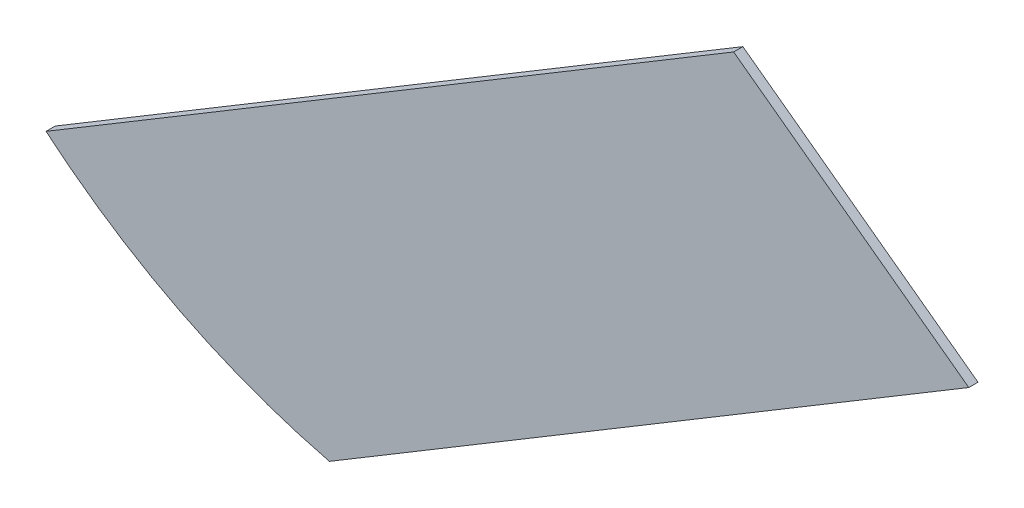
ISO-10303-21;
HEADER;
FILE_DESCRIPTION(('STEP AP214'),'2;1');
FILE_NAME('part.step','',(''),(''),'','','');
FILE_SCHEMA(('AUTOMOTIVE_DESIGN { 1 0 10303 214 1 1 1 1 }'));
ENDSEC;
DATA;
#1=APPLICATION_CONTEXT('core data for automotive mechanical design processes');
#2=APPLICATION_PROTOCOL_DEFINITION('international standard','automotive_design',2000,#1);
#3=PRODUCT_CONTEXT('',#1,'mechanical');
#4=PRODUCT('Part','Part','',(#3));
#5=PRODUCT_RELATED_PRODUCT_CATEGORY('part','',(#4));
#6=PRODUCT_DEFINITION_FORMATION('','',#4);
#7=PRODUCT_DEFINITION_CONTEXT('part definition',#1,'design');
#8=PRODUCT_DEFINITION('design','',#6,#7);
#9=PRODUCT_DEFINITION_SHAPE('','',#8);
#10=(LENGTH_UNIT() NAMED_UNIT(*) SI_UNIT(.MILLI.,.METRE.));
#11=(NAMED_UNIT(*) PLANE_ANGLE_UNIT() SI_UNIT($,.RADIAN.));
#12=(NAMED_UNIT(*) SI_UNIT($,.STERADIAN.) SOLID_ANGLE_UNIT());
#13=UNCERTAINTY_MEASURE_WITH_UNIT(LENGTH_MEASURE(1.E-05),#10,'distance_accuracy_value','');
#14=(GEOMETRIC_REPRESENTATION_CONTEXT(3) GLOBAL_UNCERTAINTY_ASSIGNED_CONTEXT((#13)) GLOBAL_UNIT_ASSIGNED_CONTEXT((#10,
#11,#12)) REPRESENTATION_CONTEXT('',''));
#15=CARTESIAN_POINT('',(0.,0.,0.));
#16=DIRECTION('',(0.,0.,1.));
#17=DIRECTION('',(1.,0.,0.));
#18=AXIS2_PLACEMENT_3D('',#15,#16,#17);
#19=CARTESIAN_POINT('',(32.574920494297,13.734089114766,2.65));
#20=DIRECTION('',(0.,0.,1.));
#21=DIRECTION('',(1.,0.,0.));
#22=AXIS2_PLACEMENT_3D('',#19,#20,#21);
#23=PLANE('',#22);
#24=CARTESIAN_POINT('',(31.455723480902,16.979222091636,2.65));
#25=DIRECTION('',(0.,0.,-1.));
#26=DIRECTION('',(-1.,0.,0.));
#27=AXIS2_PLACEMENT_3D('',#24,#25,#26);
#28=CIRCLE('',#27,0.7589976);
#29=CARTESIAN_POINT('',(31.2743120899408,16.2422232476328,2.65));
#30=VERTEX_POINT('',#29);
#31=CARTESIAN_POINT('',(30.9670153201947,16.398496949711,2.65));
#32=VERTEX_POINT('',#31);
#33=EDGE_CURVE('E20',#30,#32,#28,.T.);
#34=ORIENTED_EDGE('',*,*,#33,.F.);
#35=DIRECTION('',(-0.857492968552453,-0.514495684027672,0.));
#36=VECTOR('',#35,1.);
#37=CARTESIAN_POINT('',(31.620977437551,16.450222416942,2.65));
#38=LINE('',#37,#36);
#39=CARTESIAN_POINT('',(31.9676428108402,16.6582216016585,2.65));
#40=VERTEX_POINT('',#39);
#41=EDGE_CURVE('E75',#30,#40,#38,.F.);
#42=ORIENTED_EDGE('',*,*,#41,.T.);
#43=DIRECTION('',(0.805324891887206,-0.592833719104152,0.));
#44=VECTOR('',#43,1.);
#45=CARTESIAN_POINT('',(31.840166961259,16.752061966913,2.65));
#46=LINE('',#45,#44);
#47=CARTESIAN_POINT('',(31.712691111678,16.8459023321673,2.65));
#48=VERTEX_POINT('',#47);
#49=EDGE_CURVE('E66',#40,#48,#46,.F.);
#50=ORIENTED_EDGE('',*,*,#49,.T.);
#51=DIRECTION('',(-0.857492968552453,-0.514495684027672,0.));
#52=VECTOR('',#51,1.);
#53=CARTESIAN_POINT('',(31.339853199579,16.622199627129,2.65));
#54=LINE('',#53,#52);
#55=EDGE_CURVE('E64',#32,#48,#54,.F.);
#56=ORIENTED_EDGE('',*,*,#55,.F.);
#57=EDGE_LOOP('',(#34,#42,#50,#56));
#58=FACE_BOUND('',#57,.T.);
#59=ADVANCED_FACE('F17',(#58),#23,.T.);
#60=CARTESIAN_POINT('',(31.339853199579,16.622199627129,2.64));
#61=DIRECTION('',(-0.514495684027672,0.857492968552453,0.));
#62=DIRECTION('',(-0.857492968552453,-0.514495684027672,0.));
#63=AXIS2_PLACEMENT_3D('',#60,#61,#62);
#64=PLANE('',#63);
#65=DIRECTION('',(-0.857492968552828,-0.514495684027046,0.));
#66=VECTOR('',#65,1.);
#67=CARTESIAN_POINT('',(31.712691111678,16.845902332167,2.64));
#68=LINE('',#67,#66);
#69=CARTESIAN_POINT('',(31.7126911116781,16.8459023321671,2.64));
#70=VERTEX_POINT('',#69);
#71=CARTESIAN_POINT('',(30.9670153201947,16.398496949711,2.64));
#72=VERTEX_POINT('',#71);
#73=EDGE_CURVE('E73',#70,#72,#68,.T.);
#74=ORIENTED_EDGE('',*,*,#73,.T.);
#75=DIRECTION('',(0.,0.,-1.));
#76=VECTOR('',#75,1.);
#77=CARTESIAN_POINT('',(30.9670153146508,16.3984969543765,2.64));
#78=LINE('',#77,#76);
#79=EDGE_CURVE('E61',#32,#72,#78,.T.);
#80=ORIENTED_EDGE('',*,*,#79,.F.);
#81=ORIENTED_EDGE('',*,*,#55,.T.);
#82=DIRECTION('',(0.,0.,1.));
#83=VECTOR('',#82,1.);
#84=CARTESIAN_POINT('',(31.7126911116781,16.8459023321672,2.64));
#85=LINE('',#84,#83);
#86=EDGE_CURVE('E81',#48,#70,#85,.F.);
#87=ORIENTED_EDGE('',*,*,#86,.T.);
#88=EDGE_LOOP('',(#74,#80,#81,#87));
#89=FACE_BOUND('',#88,.T.);
#90=ADVANCED_FACE('F72',(#89),#64,.T.);
#91=CARTESIAN_POINT('',(31.455723480902,16.979222091636,2.64));
#92=DIRECTION('',(0.,0.,-1.));
#93=DIRECTION('',(-1.,0.,0.));
#94=AXIS2_PLACEMENT_3D('',#91,#92,#93);
#95=CYLINDRICAL_SURFACE('',#94,0.7589976);
#96=CARTESIAN_POINT('',(31.455723480902,16.979222091636,2.64));
#97=DIRECTION('',(0.,0.,-1.));
#98=DIRECTION('',(-1.,0.,0.));
#99=AXIS2_PLACEMENT_3D('',#96,#97,#98);
#100=CIRCLE('',#99,0.7589976);
#101=CARTESIAN_POINT('',(31.2743120899405,16.2422232476328,2.64));
#102=VERTEX_POINT('',#101);
#103=EDGE_CURVE('E92',#72,#102,#100,.F.);
#104=ORIENTED_EDGE('',*,*,#103,.T.);
#105=DIRECTION('',(0.,0.,1.));
#106=VECTOR('',#105,1.);
#107=CARTESIAN_POINT('',(31.2743120642622,16.2422232322256,2.64));
#108=LINE('',#107,#106);
#109=EDGE_CURVE('E63',#102,#30,#108,.T.);
#110=ORIENTED_EDGE('',*,*,#109,.T.);
#111=ORIENTED_EDGE('',*,*,#33,.T.);
#112=ORIENTED_EDGE('',*,*,#79,.T.);
#113=EDGE_LOOP('',(#104,#110,#111,#112));
#114=FACE_BOUND('',#113,.T.);
#115=ADVANCED_FACE('F59',(#114),#95,.T.);
#116=CARTESIAN_POINT('',(31.620977437551,16.450222416942,2.64));
#117=DIRECTION('',(-0.514495684027672,0.857492968552453,0.));
#118=DIRECTION('',(-0.857492968552453,-0.514495684027672,0.));
#119=AXIS2_PLACEMENT_3D('',#116,#117,#118);
#120=PLANE('',#119);
#121=ORIENTED_EDGE('',*,*,#109,.F.);
#122=DIRECTION('',(0.857492968552989,0.514495684026778,0.));
#123=VECTOR('',#122,1.);
#124=CARTESIAN_POINT('',(31.274312064262,16.242223232226,2.64));
#125=LINE('',#124,#123);
#126=CARTESIAN_POINT('',(31.9676428108401,16.6582216016582,2.64));
#127=VERTEX_POINT('',#126);
#128=EDGE_CURVE('E26',#102,#127,#125,.T.);
#129=ORIENTED_EDGE('',*,*,#128,.T.);
#130=DIRECTION('',(0.,0.,1.));
#131=VECTOR('',#130,1.);
#132=CARTESIAN_POINT('',(31.9676428108403,16.6582216016585,2.64));
#133=LINE('',#132,#131);
#134=EDGE_CURVE('E34',#127,#40,#133,.T.);
#135=ORIENTED_EDGE('',*,*,#134,.T.);
#136=ORIENTED_EDGE('',*,*,#41,.F.);
#137=EDGE_LOOP('',(#121,#129,#135,#136));
#138=FACE_BOUND('',#137,.T.);
#139=ADVANCED_FACE('F103',(#138),#120,.F.);
#140=CARTESIAN_POINT('',(31.840166961259,16.752061966913,2.64));
#141=DIRECTION('',(-0.592833719104152,-0.805324891887206,0.));
#142=DIRECTION('',(0.805324891887206,-0.592833719104152,0.));
#143=AXIS2_PLACEMENT_3D('',#140,#141,#142);
#144=PLANE('',#143);
#145=ORIENTED_EDGE('',*,*,#134,.F.);
#146=DIRECTION('',(-0.805324891886565,0.592833719105022,0.));
#147=VECTOR('',#146,1.);
#148=CARTESIAN_POINT('',(31.96764281084,16.658221601658,2.64));
#149=LINE('',#148,#147);
#150=EDGE_CURVE('E11',#127,#70,#149,.T.);
#151=ORIENTED_EDGE('',*,*,#150,.T.);
#152=ORIENTED_EDGE('',*,*,#86,.F.);
#153=ORIENTED_EDGE('',*,*,#49,.F.);
#154=EDGE_LOOP('',(#145,#151,#152,#153));
#155=FACE_BOUND('',#154,.T.);
#156=ADVANCED_FACE('F107',(#155),#144,.F.);
#157=CARTESIAN_POINT('',(32.574920494297,13.734089114766,2.64));
#158=DIRECTION('',(0.,0.,1.));
#159=DIRECTION('',(1.,0.,0.));
#160=AXIS2_PLACEMENT_3D('',#157,#158,#159);
#161=PLANE('',#160);
#162=ORIENTED_EDGE('',*,*,#128,.F.);
#163=ORIENTED_EDGE('',*,*,#103,.F.);
#164=ORIENTED_EDGE('',*,*,#73,.F.);
#165=ORIENTED_EDGE('',*,*,#150,.F.);
#166=EDGE_LOOP('',(#162,#163,#164,#165));
#167=FACE_BOUND('',#166,.T.);
#168=ADVANCED_FACE('F106',(#167),#161,.F.);
#169=CLOSED_SHELL('',(#59,#90,#115,#139,#156,#168));
#170=MANIFOLD_SOLID_BREP('B1',#169);
#171=ADVANCED_BREP_SHAPE_REPRESENTATION('',(#18,#170),#14);
#172=SHAPE_DEFINITION_REPRESENTATION(#9,#171);
ENDSEC;
END-ISO-10303-21;
